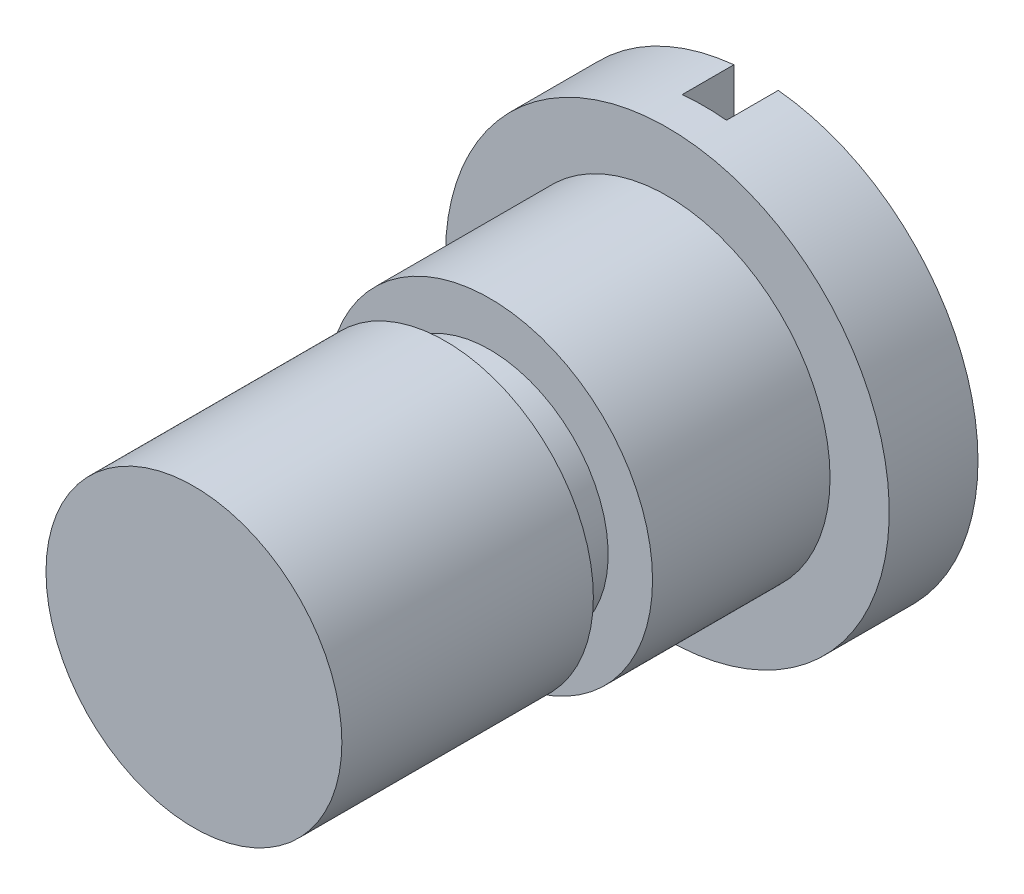
ISO-10303-21;
HEADER;
FILE_DESCRIPTION(('STEP AP214'),'2;1');
FILE_NAME('part.step','',(''),(''),'','','');
FILE_SCHEMA(('AUTOMOTIVE_DESIGN { 1 0 10303 214 1 1 1 1 }'));
ENDSEC;
DATA;
#1=APPLICATION_CONTEXT('core data for automotive mechanical design processes');
#2=APPLICATION_PROTOCOL_DEFINITION('international standard','automotive_design',2000,#1);
#3=PRODUCT_CONTEXT('',#1,'mechanical');
#4=PRODUCT('Part','Part','',(#3));
#5=PRODUCT_RELATED_PRODUCT_CATEGORY('part','',(#4));
#6=PRODUCT_DEFINITION_FORMATION('','',#4);
#7=PRODUCT_DEFINITION_CONTEXT('part definition',#1,'design');
#8=PRODUCT_DEFINITION('design','',#6,#7);
#9=PRODUCT_DEFINITION_SHAPE('','',#8);
#10=(LENGTH_UNIT() NAMED_UNIT(*) SI_UNIT(.MILLI.,.METRE.));
#11=(NAMED_UNIT(*) PLANE_ANGLE_UNIT() SI_UNIT($,.RADIAN.));
#12=(NAMED_UNIT(*) SI_UNIT($,.STERADIAN.) SOLID_ANGLE_UNIT());
#13=UNCERTAINTY_MEASURE_WITH_UNIT(LENGTH_MEASURE(1.E-05),#10,'distance_accuracy_value','');
#14=(GEOMETRIC_REPRESENTATION_CONTEXT(3) GLOBAL_UNCERTAINTY_ASSIGNED_CONTEXT((#13)) GLOBAL_UNIT_ASSIGNED_CONTEXT((#10,
#11,#12)) REPRESENTATION_CONTEXT('',''));
#15=CARTESIAN_POINT('',(0.,0.,0.));
#16=DIRECTION('',(0.,0.,1.));
#17=DIRECTION('',(1.,0.,0.));
#18=AXIS2_PLACEMENT_3D('',#15,#16,#17);
#19=CARTESIAN_POINT('',(0.,15.,-38.));
#20=DIRECTION('',(0.,0.,-1.));
#21=DIRECTION('',(-1.,0.,0.));
#22=AXIS2_PLACEMENT_3D('',#19,#20,#21);
#23=PLANE('',#22);
#24=DIRECTION('',(0.,1.,0.));
#25=VECTOR('',#24,1.);
#26=CARTESIAN_POINT('',(-1.5,-14.9248115565993,-38.));
#27=LINE('',#26,#25);
#28=CARTESIAN_POINT('',(-1.5,-14.9248115565993,-38.));
#29=VERTEX_POINT('',#28);
#30=CARTESIAN_POINT('',(-1.5,14.9248115565993,-38.));
#31=VERTEX_POINT('',#30);
#32=EDGE_CURVE('E79',#29,#31,#27,.T.);
#33=ORIENTED_EDGE('',*,*,#32,.F.);
#34=CARTESIAN_POINT('',(0.,0.,-38.));
#35=DIRECTION('',(0.,0.,-1.));
#36=DIRECTION('',(-1.,0.,0.));
#37=AXIS2_PLACEMENT_3D('',#34,#35,#36);
#38=CIRCLE('',#37,15.);
#39=EDGE_CURVE('E121',#29,#31,#38,.T.);
#40=ORIENTED_EDGE('',*,*,#39,.T.);
#41=EDGE_LOOP('',(#33,#40));
#42=FACE_BOUND('',#41,.T.);
#43=ADVANCED_FACE('F40',(#42),#23,.T.);
#44=CARTESIAN_POINT('',(0.,0.,0.));
#45=DIRECTION('',(0.,0.,1.));
#46=DIRECTION('',(1.,0.,0.));
#47=AXIS2_PLACEMENT_3D('',#44,#45,#46);
#48=PLANE('',#47);
#49=CARTESIAN_POINT('',(0.,0.,0.));
#50=DIRECTION('',(0.,0.,-1.));
#51=DIRECTION('',(-1.,0.,0.));
#52=AXIS2_PLACEMENT_3D('',#49,#50,#51);
#53=CIRCLE('',#52,10.);
#54=CARTESIAN_POINT('',(-10.,0.,0.));
#55=VERTEX_POINT('',#54);
#56=EDGE_CURVE('E11',#55,#55,#53,.T.);
#57=ORIENTED_EDGE('',*,*,#56,.F.);
#58=EDGE_LOOP('',(#57));
#59=FACE_BOUND('',#58,.T.);
#60=ADVANCED_FACE('F42',(#59),#48,.T.);
#61=CARTESIAN_POINT('',(0.,0.,-38.));
#62=DIRECTION('',(0.,0.,-1.));
#63=DIRECTION('',(-1.,0.,0.));
#64=AXIS2_PLACEMENT_3D('',#61,#62,#63);
#65=CYLINDRICAL_SURFACE('',#64,10.);
#66=ORIENTED_EDGE('',*,*,#56,.T.);
#67=EDGE_LOOP('',(#66));
#68=FACE_BOUND('',#67,.T.);
#69=CARTESIAN_POINT('',(0.,0.,-17.));
#70=DIRECTION('',(0.,0.,-1.));
#71=DIRECTION('',(-1.,0.,0.));
#72=AXIS2_PLACEMENT_3D('',#69,#70,#71);
#73=CIRCLE('',#72,10.);
#74=CARTESIAN_POINT('',(-10.,0.,-17.));
#75=VERTEX_POINT('',#74);
#76=EDGE_CURVE('E49',#75,#75,#73,.T.);
#77=ORIENTED_EDGE('',*,*,#76,.F.);
#78=EDGE_LOOP('',(#77));
#79=FACE_BOUND('',#78,.T.);
#80=ADVANCED_FACE('F157',(#68,#79),#65,.T.);
#81=CARTESIAN_POINT('',(0.,10.,-17.));
#82=DIRECTION('',(0.,0.,-1.));
#83=DIRECTION('',(-1.,0.,0.));
#84=AXIS2_PLACEMENT_3D('',#81,#82,#83);
#85=PLANE('',#84);
#86=ORIENTED_EDGE('',*,*,#76,.T.);
#87=EDGE_LOOP('',(#86));
#88=FACE_BOUND('',#87,.T.);
#89=CARTESIAN_POINT('',(0.,0.,-17.));
#90=DIRECTION('',(0.,0.,-1.));
#91=DIRECTION('',(-1.,0.,0.));
#92=AXIS2_PLACEMENT_3D('',#89,#90,#91);
#93=CIRCLE('',#92,8.);
#94=CARTESIAN_POINT('',(-8.,0.,-17.));
#95=VERTEX_POINT('',#94);
#96=EDGE_CURVE('E146',#95,#95,#93,.T.);
#97=ORIENTED_EDGE('',*,*,#96,.F.);
#98=EDGE_LOOP('',(#97));
#99=FACE_BOUND('',#98,.T.);
#100=ADVANCED_FACE('F154',(#88,#99),#85,.T.);
#101=CARTESIAN_POINT('',(0.,0.,-38.));
#102=DIRECTION('',(0.,0.,-1.));
#103=DIRECTION('',(-1.,0.,0.));
#104=AXIS2_PLACEMENT_3D('',#101,#102,#103);
#105=CYLINDRICAL_SURFACE('',#104,8.);
#106=ORIENTED_EDGE('',*,*,#96,.T.);
#107=EDGE_LOOP('',(#106));
#108=FACE_BOUND('',#107,.T.);
#109=CARTESIAN_POINT('',(0.,0.,-20.));
#110=DIRECTION('',(0.,0.,-1.));
#111=DIRECTION('',(-1.,0.,0.));
#112=AXIS2_PLACEMENT_3D('',#109,#110,#111);
#113=CIRCLE('',#112,8.);
#114=CARTESIAN_POINT('',(-8.,0.,-20.));
#115=VERTEX_POINT('',#114);
#116=EDGE_CURVE('E142',#115,#115,#113,.T.);
#117=ORIENTED_EDGE('',*,*,#116,.F.);
#118=EDGE_LOOP('',(#117));
#119=FACE_BOUND('',#118,.T.);
#120=ADVANCED_FACE('F164',(#108,#119),#105,.T.);
#121=CARTESIAN_POINT('',(0.,8.,-20.));
#122=DIRECTION('',(0.,0.,1.));
#123=DIRECTION('',(1.,0.,0.));
#124=AXIS2_PLACEMENT_3D('',#121,#122,#123);
#125=PLANE('',#124);
#126=ORIENTED_EDGE('',*,*,#116,.T.);
#127=EDGE_LOOP('',(#126));
#128=FACE_BOUND('',#127,.T.);
#129=CARTESIAN_POINT('',(0.,0.,-20.));
#130=DIRECTION('',(0.,0.,-1.));
#131=DIRECTION('',(-1.,0.,0.));
#132=AXIS2_PLACEMENT_3D('',#129,#130,#131);
#133=CIRCLE('',#132,11.);
#134=CARTESIAN_POINT('',(-11.,0.,-20.));
#135=VERTEX_POINT('',#134);
#136=EDGE_CURVE('E138',#135,#135,#133,.T.);
#137=ORIENTED_EDGE('',*,*,#136,.F.);
#138=EDGE_LOOP('',(#137));
#139=FACE_BOUND('',#138,.T.);
#140=ADVANCED_FACE('F211',(#128,#139),#125,.T.);
#141=CARTESIAN_POINT('',(0.,0.,-38.));
#142=DIRECTION('',(0.,0.,-1.));
#143=DIRECTION('',(-1.,0.,0.));
#144=AXIS2_PLACEMENT_3D('',#141,#142,#143);
#145=CYLINDRICAL_SURFACE('',#144,11.);
#146=ORIENTED_EDGE('',*,*,#136,.T.);
#147=EDGE_LOOP('',(#146));
#148=FACE_BOUND('',#147,.T.);
#149=CARTESIAN_POINT('',(0.,0.,-32.));
#150=DIRECTION('',(0.,0.,-1.));
#151=DIRECTION('',(-1.,0.,0.));
#152=AXIS2_PLACEMENT_3D('',#149,#150,#151);
#153=CIRCLE('',#152,11.);
#154=CARTESIAN_POINT('',(-11.,0.,-32.));
#155=VERTEX_POINT('',#154);
#156=EDGE_CURVE('E134',#155,#155,#153,.T.);
#157=ORIENTED_EDGE('',*,*,#156,.F.);
#158=EDGE_LOOP('',(#157));
#159=FACE_BOUND('',#158,.T.);
#160=ADVANCED_FACE('F205',(#148,#159),#145,.T.);
#161=CARTESIAN_POINT('',(0.,11.,-32.));
#162=DIRECTION('',(0.,0.,1.));
#163=DIRECTION('',(1.,0.,0.));
#164=AXIS2_PLACEMENT_3D('',#161,#162,#163);
#165=PLANE('',#164);
#166=ORIENTED_EDGE('',*,*,#156,.T.);
#167=EDGE_LOOP('',(#166));
#168=FACE_BOUND('',#167,.T.);
#169=CARTESIAN_POINT('',(0.,0.,-32.));
#170=DIRECTION('',(0.,0.,-1.));
#171=DIRECTION('',(-1.,0.,0.));
#172=AXIS2_PLACEMENT_3D('',#169,#170,#171);
#173=CIRCLE('',#172,15.);
#174=CARTESIAN_POINT('',(-15.,0.,-32.));
#175=VERTEX_POINT('',#174);
#176=EDGE_CURVE('E130',#175,#175,#173,.T.);
#177=ORIENTED_EDGE('',*,*,#176,.F.);
#178=EDGE_LOOP('',(#177));
#179=FACE_BOUND('',#178,.T.);
#180=ADVANCED_FACE('F183',(#168,#179),#165,.T.);
#181=CARTESIAN_POINT('',(0.,0.,-38.));
#182=DIRECTION('',(0.,0.,-1.));
#183=DIRECTION('',(-1.,0.,0.));
#184=AXIS2_PLACEMENT_3D('',#181,#182,#183);
#185=CYLINDRICAL_SURFACE('',#184,15.);
#186=DIRECTION('',(0.,0.,-1.));
#187=VECTOR('',#186,1.);
#188=CARTESIAN_POINT('',(-1.5,-14.9248115565993,-34.5));
#189=LINE('',#188,#187);
#190=CARTESIAN_POINT('',(-1.5,-14.9248115565993,-34.5));
#191=VERTEX_POINT('',#190);
#192=EDGE_CURVE('E94',#191,#29,#189,.T.);
#193=ORIENTED_EDGE('',*,*,#192,.F.);
#194=CARTESIAN_POINT('',(0.,0.,-34.5));
#195=DIRECTION('',(0.,0.,-1.));
#196=DIRECTION('',(-1.,0.,0.));
#197=AXIS2_PLACEMENT_3D('',#194,#195,#196);
#198=CIRCLE('',#197,15.);
#199=CARTESIAN_POINT('',(1.5,-14.9248115565993,-34.5));
#200=VERTEX_POINT('',#199);
#201=EDGE_CURVE('E98',#200,#191,#198,.T.);
#202=ORIENTED_EDGE('',*,*,#201,.F.);
#203=DIRECTION('',(0.,0.,-1.));
#204=VECTOR('',#203,1.);
#205=CARTESIAN_POINT('',(1.5,-14.9248115565993,-34.5));
#206=LINE('',#205,#204);
#207=CARTESIAN_POINT('',(1.5,-14.9248115565993,-38.));
#208=VERTEX_POINT('',#207);
#209=EDGE_CURVE('E86',#200,#208,#206,.T.);
#210=ORIENTED_EDGE('',*,*,#209,.T.);
#211=CARTESIAN_POINT('',(1.5,14.9248115565993,-38.));
#212=VERTEX_POINT('',#211);
#213=EDGE_CURVE('E129',#212,#208,#38,.T.);
#214=ORIENTED_EDGE('',*,*,#213,.F.);
#215=DIRECTION('',(0.,0.,-1.));
#216=VECTOR('',#215,1.);
#217=CARTESIAN_POINT('',(1.5,14.9248115565993,-34.5));
#218=LINE('',#217,#216);
#219=CARTESIAN_POINT('',(1.5,14.9248115565993,-34.5));
#220=VERTEX_POINT('',#219);
#221=EDGE_CURVE('E56',#220,#212,#218,.T.);
#222=ORIENTED_EDGE('',*,*,#221,.F.);
#223=CARTESIAN_POINT('',(0.,0.,-34.5));
#224=DIRECTION('',(0.,0.,-1.));
#225=DIRECTION('',(-1.,0.,0.));
#226=AXIS2_PLACEMENT_3D('',#223,#224,#225);
#227=CIRCLE('',#226,15.);
#228=CARTESIAN_POINT('',(-1.5,14.9248115565993,-34.5));
#229=VERTEX_POINT('',#228);
#230=EDGE_CURVE('E100',#229,#220,#227,.T.);
#231=ORIENTED_EDGE('',*,*,#230,.F.);
#232=DIRECTION('',(0.,0.,-1.));
#233=VECTOR('',#232,1.);
#234=CARTESIAN_POINT('',(-1.5,14.9248115565993,-34.5));
#235=LINE('',#234,#233);
#236=EDGE_CURVE('E65',#229,#31,#235,.T.);
#237=ORIENTED_EDGE('',*,*,#236,.T.);
#238=ORIENTED_EDGE('',*,*,#39,.F.);
#239=EDGE_LOOP('',(#193,#202,#210,#214,#222,#231,#237,#238));
#240=FACE_BOUND('',#239,.T.);
#241=ORIENTED_EDGE('',*,*,#176,.T.);
#242=EDGE_LOOP('',(#241));
#243=FACE_BOUND('',#242,.T.);
#244=ADVANCED_FACE('F104',(#240,#243),#185,.T.);
#245=DIRECTION('',(0.,-1.,0.));
#246=VECTOR('',#245,1.);
#247=CARTESIAN_POINT('',(1.5,14.9248115565993,-38.));
#248=LINE('',#247,#246);
#249=EDGE_CURVE('E88',#212,#208,#248,.T.);
#250=ORIENTED_EDGE('',*,*,#249,.F.);
#251=ORIENTED_EDGE('',*,*,#213,.T.);
#252=EDGE_LOOP('',(#250,#251));
#253=FACE_BOUND('',#252,.T.);
#254=ADVANCED_FACE('F170',(#253),#23,.T.);
#255=CARTESIAN_POINT('',(-1.5,-14.9248115565993,-34.5));
#256=DIRECTION('',(-1.,0.,0.));
#257=DIRECTION('',(0.,0.,1.));
#258=AXIS2_PLACEMENT_3D('',#255,#256,#257);
#259=PLANE('',#258);
#260=ORIENTED_EDGE('',*,*,#32,.T.);
#261=ORIENTED_EDGE('',*,*,#236,.F.);
#262=DIRECTION('',(0.,1.,0.));
#263=VECTOR('',#262,1.);
#264=CARTESIAN_POINT('',(-1.5,-14.9248115565993,-34.5));
#265=LINE('',#264,#263);
#266=EDGE_CURVE('E108',#191,#229,#265,.T.);
#267=ORIENTED_EDGE('',*,*,#266,.F.);
#268=ORIENTED_EDGE('',*,*,#192,.T.);
#269=EDGE_LOOP('',(#260,#261,#267,#268));
#270=FACE_BOUND('',#269,.T.);
#271=ADVANCED_FACE('F176',(#270),#259,.F.);
#272=CARTESIAN_POINT('',(1.5,14.9248115565993,-34.5));
#273=DIRECTION('',(1.,0.,0.));
#274=DIRECTION('',(0.,0.,-1.));
#275=AXIS2_PLACEMENT_3D('',#272,#273,#274);
#276=PLANE('',#275);
#277=ORIENTED_EDGE('',*,*,#249,.T.);
#278=ORIENTED_EDGE('',*,*,#209,.F.);
#279=DIRECTION('',(0.,-1.,0.));
#280=VECTOR('',#279,1.);
#281=CARTESIAN_POINT('',(1.5,14.9248115565993,-34.5));
#282=LINE('',#281,#280);
#283=EDGE_CURVE('E83',#220,#200,#282,.T.);
#284=ORIENTED_EDGE('',*,*,#283,.F.);
#285=ORIENTED_EDGE('',*,*,#221,.T.);
#286=EDGE_LOOP('',(#277,#278,#284,#285));
#287=FACE_BOUND('',#286,.T.);
#288=ADVANCED_FACE('F87',(#287),#276,.F.);
#289=CARTESIAN_POINT('',(0.,0.,-34.5));
#290=DIRECTION('',(0.,0.,-1.));
#291=DIRECTION('',(-1.,0.,0.));
#292=AXIS2_PLACEMENT_3D('',#289,#290,#291);
#293=PLANE('',#292);
#294=ORIENTED_EDGE('',*,*,#230,.T.);
#295=ORIENTED_EDGE('',*,*,#283,.T.);
#296=ORIENTED_EDGE('',*,*,#201,.T.);
#297=ORIENTED_EDGE('',*,*,#266,.T.);
#298=EDGE_LOOP('',(#294,#295,#296,#297));
#299=FACE_BOUND('',#298,.T.);
#300=ADVANCED_FACE('F97',(#299),#293,.T.);
#301=CLOSED_SHELL('',(#43,#60,#80,#100,#120,#140,#160,#180,#244,#254,#271,#288,#300));
#302=MANIFOLD_SOLID_BREP('B2',#301);
#303=ADVANCED_BREP_SHAPE_REPRESENTATION('',(#18,#302),#14);
#304=SHAPE_DEFINITION_REPRESENTATION(#9,#303);
ENDSEC;
END-ISO-10303-21;
